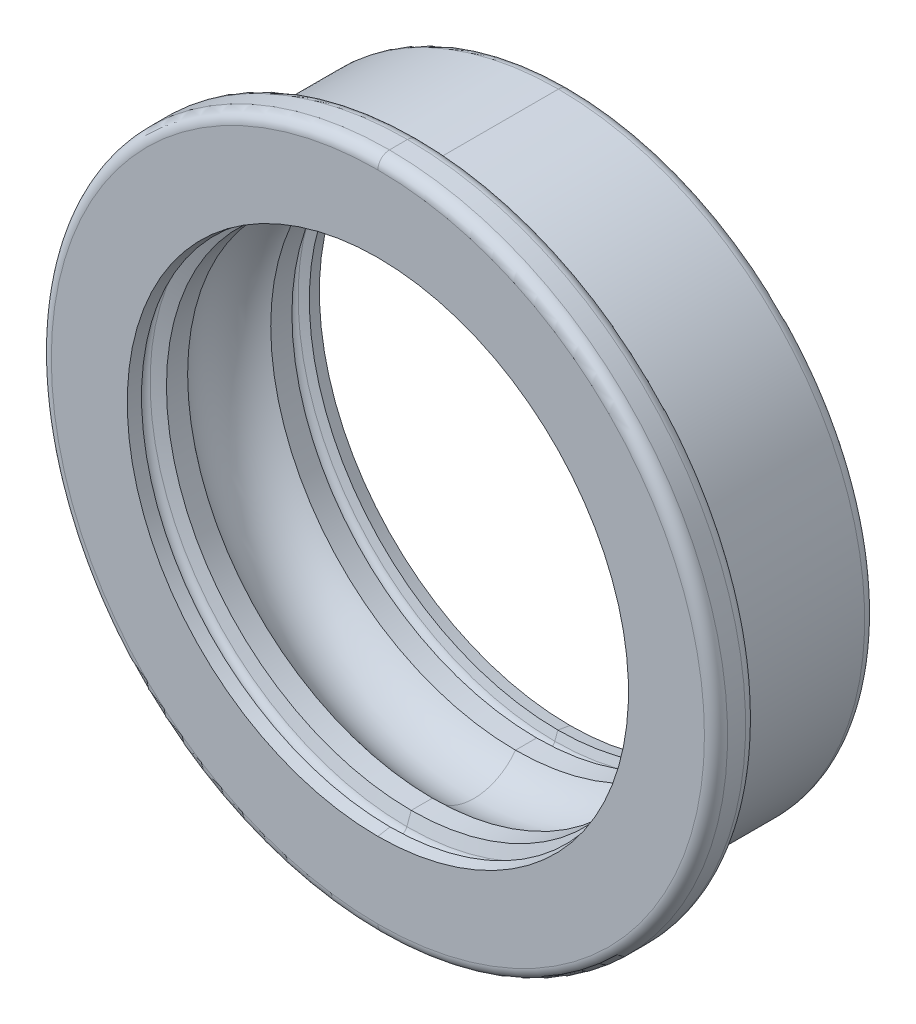
ISO-10303-21;
HEADER;
FILE_DESCRIPTION(('STEP AP214'),'2;1');
FILE_NAME('part.step','',(''),(''),'','','');
FILE_SCHEMA(('AUTOMOTIVE_DESIGN { 1 0 10303 214 1 1 1 1 }'));
ENDSEC;
DATA;
#1=APPLICATION_CONTEXT('core data for automotive mechanical design processes');
#2=APPLICATION_PROTOCOL_DEFINITION('international standard','automotive_design',2000,#1);
#3=PRODUCT_CONTEXT('',#1,'mechanical');
#4=PRODUCT('Part','Part','',(#3));
#5=PRODUCT_RELATED_PRODUCT_CATEGORY('part','',(#4));
#6=PRODUCT_DEFINITION_FORMATION('','',#4);
#7=PRODUCT_DEFINITION_CONTEXT('part definition',#1,'design');
#8=PRODUCT_DEFINITION('design','',#6,#7);
#9=PRODUCT_DEFINITION_SHAPE('','',#8);
#10=(LENGTH_UNIT() NAMED_UNIT(*) SI_UNIT(.MILLI.,.METRE.));
#11=(NAMED_UNIT(*) PLANE_ANGLE_UNIT() SI_UNIT($,.RADIAN.));
#12=(NAMED_UNIT(*) SI_UNIT($,.STERADIAN.) SOLID_ANGLE_UNIT());
#13=UNCERTAINTY_MEASURE_WITH_UNIT(LENGTH_MEASURE(1.E-05),#10,'distance_accuracy_value','');
#14=(GEOMETRIC_REPRESENTATION_CONTEXT(3) GLOBAL_UNCERTAINTY_ASSIGNED_CONTEXT((#13)) GLOBAL_UNIT_ASSIGNED_CONTEXT((#10,
#11,#12)) REPRESENTATION_CONTEXT('',''));
#15=CARTESIAN_POINT('',(0.,0.,0.));
#16=DIRECTION('',(0.,0.,1.));
#17=DIRECTION('',(1.,0.,0.));
#18=AXIS2_PLACEMENT_3D('',#15,#16,#17);
#19=CARTESIAN_POINT('',(0.,0.,2.18473570132836));
#20=DIRECTION('',(0.,0.,-1.));
#21=DIRECTION('',(0.,-1.,0.));
#22=AXIS2_PLACEMENT_3D('',#19,#20,#21);
#23=CONICAL_SURFACE('',#22,6.41101207873231,1.22173047639603);
#24=DIRECTION('',(0.,0.939692620785909,-0.342020143325669));
#25=VECTOR('',#24,1.);
#26=CARTESIAN_POINT('',(0.,6.43951920558143,2.17435995569083));
#27=LINE('',#26,#25);
#28=CARTESIAN_POINT('',(0.,6.4395192055807,2.17435995569106));
#29=VERTEX_POINT('',#28);
#30=CARTESIAN_POINT('',(0.,6.65285673739189,2.09671144426003));
#31=VERTEX_POINT('',#30);
#32=EDGE_CURVE('E421',#29,#31,#27,.T.);
#33=ORIENTED_EDGE('',*,*,#32,.T.);
#34=CARTESIAN_POINT('',(0.,0.,2.09671144426005));
#35=DIRECTION('',(0.,0.,-1.));
#36=DIRECTION('',(0.,1.,0.));
#37=AXIS2_PLACEMENT_3D('',#34,#35,#36);
#38=CIRCLE('',#37,6.6528567373919);
#39=CARTESIAN_POINT('',(0.,-6.65285673739189,2.09671144426003));
#40=VERTEX_POINT('',#39);
#41=EDGE_CURVE('E400',#31,#40,#38,.T.);
#42=ORIENTED_EDGE('',*,*,#41,.T.);
#43=DIRECTION('',(0.,-0.939692620785909,-0.342020143325669));
#44=VECTOR('',#43,1.);
#45=CARTESIAN_POINT('',(0.,-6.43951920558143,2.17435995569083));
#46=LINE('',#45,#44);
#47=CARTESIAN_POINT('',(0.,-6.4395192055807,2.17435995569106));
#48=VERTEX_POINT('',#47);
#49=EDGE_CURVE('E20',#48,#40,#46,.T.);
#50=ORIENTED_EDGE('',*,*,#49,.F.);
#51=CARTESIAN_POINT('',(0.,0.,2.17435995569127));
#52=DIRECTION('',(0.,0.,1.));
#53=DIRECTION('',(0.,-1.,0.));
#54=AXIS2_PLACEMENT_3D('',#51,#52,#53);
#55=CIRCLE('',#54,6.43951920557997);
#56=EDGE_CURVE('E11',#48,#29,#55,.T.);
#57=ORIENTED_EDGE('',*,*,#56,.T.);
#58=EDGE_LOOP('',(#33,#42,#50,#57));
#59=FACE_BOUND('',#58,.T.);
#60=ADVANCED_FACE('F17',(#59),#23,.F.);
#61=CARTESIAN_POINT('',(0.,0.,2.14448418683228));
#62=DIRECTION('',(0.,0.,1.));
#63=DIRECTION('',(0.,1.,0.));
#64=AXIS2_PLACEMENT_3D('',#61,#62,#63);
#65=CONICAL_SURFACE('',#64,6.43425130146072,0.174532925199433);
#66=DIRECTION('',(0.,-0.173648177666928,0.984807753012208));
#67=VECTOR('',#66,1.);
#68=CARTESIAN_POINT('',(0.,-6.43951920557997,2.17435995569128));
#69=LINE('',#68,#67);
#70=CARTESIAN_POINT('',(0.,-6.49503399999938,2.48920000000011));
#71=VERTEX_POINT('',#70);
#72=EDGE_CURVE('E425',#48,#71,#69,.T.);
#73=ORIENTED_EDGE('',*,*,#72,.T.);
#74=CARTESIAN_POINT('',(0.,0.,2.48920000000016));
#75=DIRECTION('',(0.,0.,1.));
#76=DIRECTION('',(0.,-1.,0.));
#77=AXIS2_PLACEMENT_3D('',#74,#75,#76);
#78=CIRCLE('',#77,6.49503399999907);
#79=CARTESIAN_POINT('',(0.,6.49503399999938,2.48920000000011));
#80=VERTEX_POINT('',#79);
#81=EDGE_CURVE('E197',#71,#80,#78,.T.);
#82=ORIENTED_EDGE('',*,*,#81,.T.);
#83=DIRECTION('',(0.,0.173648177666928,0.984807753012208));
#84=VECTOR('',#83,1.);
#85=CARTESIAN_POINT('',(0.,6.43951920557997,2.17435995569128));
#86=LINE('',#85,#84);
#87=EDGE_CURVE('E25',#29,#80,#86,.T.);
#88=ORIENTED_EDGE('',*,*,#87,.F.);
#89=ORIENTED_EDGE('',*,*,#56,.F.);
#90=EDGE_LOOP('',(#73,#82,#88,#89));
#91=FACE_BOUND('',#90,.T.);
#92=ADVANCED_FACE('F436',(#91),#65,.F.);
#93=CARTESIAN_POINT('',(0.,0.,2.14448418683228));
#94=DIRECTION('',(0.,0.,1.));
#95=DIRECTION('',(0.,1.,0.));
#96=AXIS2_PLACEMENT_3D('',#93,#94,#95);
#97=CONICAL_SURFACE('',#96,6.43425130146072,0.174532925199433);
#98=ORIENTED_EDGE('',*,*,#87,.T.);
#99=CARTESIAN_POINT('',(0.,0.,2.48920000000016));
#100=DIRECTION('',(0.,0.,1.));
#101=DIRECTION('',(0.,1.,0.));
#102=AXIS2_PLACEMENT_3D('',#99,#100,#101);
#103=CIRCLE('',#102,6.49503399999907);
#104=EDGE_CURVE('E208',#80,#71,#103,.T.);
#105=ORIENTED_EDGE('',*,*,#104,.T.);
#106=ORIENTED_EDGE('',*,*,#72,.F.);
#107=CARTESIAN_POINT('',(0.,0.,2.17435995569127));
#108=DIRECTION('',(0.,0.,1.));
#109=DIRECTION('',(0.,1.,0.));
#110=AXIS2_PLACEMENT_3D('',#107,#108,#109);
#111=CIRCLE('',#110,6.43951920557997);
#112=EDGE_CURVE('E420',#29,#48,#111,.T.);
#113=ORIENTED_EDGE('',*,*,#112,.F.);
#114=EDGE_LOOP('',(#98,#105,#106,#113));
#115=FACE_BOUND('',#114,.T.);
#116=ADVANCED_FACE('F430',(#115),#97,.F.);
#117=CARTESIAN_POINT('',(0.,0.,2.18473570132836));
#118=DIRECTION('',(0.,0.,-1.));
#119=DIRECTION('',(0.,-1.,0.));
#120=AXIS2_PLACEMENT_3D('',#117,#118,#119);
#121=CONICAL_SURFACE('',#120,6.41101207873231,1.22173047639603);
#122=ORIENTED_EDGE('',*,*,#49,.T.);
#123=CARTESIAN_POINT('',(0.,0.,2.09671144426005));
#124=DIRECTION('',(0.,0.,-1.));
#125=DIRECTION('',(0.,-1.,0.));
#126=AXIS2_PLACEMENT_3D('',#123,#124,#125);
#127=CIRCLE('',#126,6.6528567373919);
#128=EDGE_CURVE('E407',#40,#31,#127,.T.);
#129=ORIENTED_EDGE('',*,*,#128,.T.);
#130=ORIENTED_EDGE('',*,*,#32,.F.);
#131=ORIENTED_EDGE('',*,*,#112,.T.);
#132=EDGE_LOOP('',(#122,#129,#130,#131));
#133=FACE_BOUND('',#132,.T.);
#134=ADVANCED_FACE('F438',(#133),#121,.F.);
#135=CARTESIAN_POINT('',(0.,0.,1.9177));
#136=DIRECTION('',(0.,0.,-1.));
#137=DIRECTION('',(0.,-1.,0.));
#138=AXIS2_PLACEMENT_3D('',#135,#136,#137);
#139=TOROIDAL_SURFACE('',#138,6.58770190008928,0.1905);
#140=ORIENTED_EDGE('',*,*,#128,.F.);
#141=CARTESIAN_POINT('',(0.,-6.58770190008928,1.9177));
#142=DIRECTION('',(1.,0.,0.));
#143=DIRECTION('',(0.,-0.342020143320849,0.939692620787662));
#144=AXIS2_PLACEMENT_3D('',#141,#142,#143);
#145=CIRCLE('',#144,0.1905);
#146=CARTESIAN_POINT('',(0.,-6.77820190008928,1.9177));
#147=VERTEX_POINT('',#146);
#148=EDGE_CURVE('E402',#40,#147,#145,.T.);
#149=ORIENTED_EDGE('',*,*,#148,.T.);
#150=CARTESIAN_POINT('',(0.,-6.58770190008928,1.9177));
#151=DIRECTION('',(1.,0.,0.));
#152=DIRECTION('',(0.,-1.,0.));
#153=AXIS2_PLACEMENT_3D('',#150,#151,#152);
#154=CIRCLE('',#153,0.1905);
#155=CARTESIAN_POINT('',(0.,-6.65285673739188,1.73868855574004));
#156=VERTEX_POINT('',#155);
#157=EDGE_CURVE('E405',#147,#156,#154,.T.);
#158=ORIENTED_EDGE('',*,*,#157,.T.);
#159=CARTESIAN_POINT('',(0.,0.,1.73868855573995));
#160=DIRECTION('',(0.,0.,1.));
#161=DIRECTION('',(0.,1.,0.));
#162=AXIS2_PLACEMENT_3D('',#159,#160,#161);
#163=CIRCLE('',#162,6.6528567373919);
#164=CARTESIAN_POINT('',(0.,6.65285673739188,1.73868855574004));
#165=VERTEX_POINT('',#164);
#166=EDGE_CURVE('E397',#165,#156,#163,.T.);
#167=ORIENTED_EDGE('',*,*,#166,.F.);
#168=CARTESIAN_POINT('',(0.,6.58770190008928,1.9177));
#169=DIRECTION('',(-1.,0.,0.));
#170=DIRECTION('',(0.,1.,0.));
#171=AXIS2_PLACEMENT_3D('',#168,#169,#170);
#172=CIRCLE('',#171,0.1905);
#173=CARTESIAN_POINT('',(0.,6.77820190008928,1.9177));
#174=VERTEX_POINT('',#173);
#175=EDGE_CURVE('E411',#174,#165,#172,.T.);
#176=ORIENTED_EDGE('',*,*,#175,.F.);
#177=CARTESIAN_POINT('',(0.,6.58770190008928,1.9177));
#178=DIRECTION('',(-1.,0.,0.));
#179=DIRECTION('',(0.,0.342020143320849,0.939692620787662));
#180=AXIS2_PLACEMENT_3D('',#177,#178,#179);
#181=CIRCLE('',#180,0.1905);
#182=EDGE_CURVE('E403',#31,#174,#181,.T.);
#183=ORIENTED_EDGE('',*,*,#182,.F.);
#184=EDGE_LOOP('',(#140,#149,#158,#167,#176,#183));
#185=FACE_BOUND('',#184,.T.);
#186=ADVANCED_FACE('F448',(#185),#139,.F.);
#187=CARTESIAN_POINT('',(0.,0.,1.9177));
#188=DIRECTION('',(0.,0.,-1.));
#189=DIRECTION('',(0.,-1.,0.));
#190=AXIS2_PLACEMENT_3D('',#187,#188,#189);
#191=TOROIDAL_SURFACE('',#190,6.58770190008928,0.1905);
#192=CARTESIAN_POINT('',(0.,0.,1.73868855573995));
#193=DIRECTION('',(0.,0.,1.));
#194=DIRECTION('',(0.,-1.,0.));
#195=AXIS2_PLACEMENT_3D('',#192,#193,#194);
#196=CIRCLE('',#195,6.6528567373919);
#197=EDGE_CURVE('E408',#156,#165,#196,.T.);
#198=ORIENTED_EDGE('',*,*,#197,.F.);
#199=ORIENTED_EDGE('',*,*,#157,.F.);
#200=ORIENTED_EDGE('',*,*,#148,.F.);
#201=ORIENTED_EDGE('',*,*,#41,.F.);
#202=ORIENTED_EDGE('',*,*,#182,.T.);
#203=ORIENTED_EDGE('',*,*,#175,.T.);
#204=EDGE_LOOP('',(#198,#199,#200,#201,#202,#203));
#205=FACE_BOUND('',#204,.T.);
#206=ADVANCED_FACE('F445',(#205),#191,.F.);
#207=CARTESIAN_POINT('',(0.,0.,1.61546132153431));
#208=DIRECTION('',(0.,0.,1.));
#209=DIRECTION('',(0.,1.,0.));
#210=AXIS2_PLACEMENT_3D('',#207,#208,#209);
#211=CONICAL_SURFACE('',#210,6.31429269394952,1.22173047639603);
#212=CARTESIAN_POINT('',(0.,0.,1.62583706717184));
#213=DIRECTION('',(0.,0.,1.));
#214=DIRECTION('',(0.,-1.,0.));
#215=AXIS2_PLACEMENT_3D('',#212,#213,#214);
#216=CIRCLE('',#215,6.34279982079864);
#217=CARTESIAN_POINT('',(0.,-6.34279982079865,1.62583706717181));
#218=VERTEX_POINT('',#217);
#219=CARTESIAN_POINT('',(0.,6.34279982079865,1.62583706717181));
#220=VERTEX_POINT('',#219);
#221=EDGE_CURVE('E386',#218,#220,#216,.T.);
#222=ORIENTED_EDGE('',*,*,#221,.F.);
#223=DIRECTION('',(0.,0.939692620785908,-0.342020143325669));
#224=VECTOR('',#223,1.);
#225=CARTESIAN_POINT('',(0.,-6.65285673739185,1.73868855574012));
#226=LINE('',#225,#224);
#227=EDGE_CURVE('E392',#156,#218,#226,.T.);
#228=ORIENTED_EDGE('',*,*,#227,.F.);
#229=ORIENTED_EDGE('',*,*,#197,.T.);
#230=DIRECTION('',(0.,-0.939692620785908,-0.342020143325669));
#231=VECTOR('',#230,1.);
#232=CARTESIAN_POINT('',(0.,6.65285673739185,1.73868855574012));
#233=LINE('',#232,#231);
#234=EDGE_CURVE('E390',#165,#220,#233,.T.);
#235=ORIENTED_EDGE('',*,*,#234,.T.);
#236=EDGE_LOOP('',(#222,#228,#229,#235));
#237=FACE_BOUND('',#236,.T.);
#238=ADVANCED_FACE('F452',(#237),#211,.F.);
#239=CARTESIAN_POINT('',(0.,0.,1.61546132153431));
#240=DIRECTION('',(0.,0.,1.));
#241=DIRECTION('',(0.,1.,0.));
#242=AXIS2_PLACEMENT_3D('',#239,#240,#241);
#243=CONICAL_SURFACE('',#242,6.31429269394952,1.22173047639603);
#244=ORIENTED_EDGE('',*,*,#166,.T.);
#245=ORIENTED_EDGE('',*,*,#227,.T.);
#246=CARTESIAN_POINT('',(0.,0.,1.62583706717184));
#247=DIRECTION('',(0.,0.,1.));
#248=DIRECTION('',(0.,1.,0.));
#249=AXIS2_PLACEMENT_3D('',#246,#247,#248);
#250=CIRCLE('',#249,6.34279982079864);
#251=EDGE_CURVE('E389',#220,#218,#250,.T.);
#252=ORIENTED_EDGE('',*,*,#251,.F.);
#253=ORIENTED_EDGE('',*,*,#234,.F.);
#254=EDGE_LOOP('',(#244,#245,#252,#253));
#255=FACE_BOUND('',#254,.T.);
#256=ADVANCED_FACE('F455',(#255),#243,.F.);
#257=CARTESIAN_POINT('',(0.,0.,0.12446));
#258=DIRECTION('',(0.,0.,-1.));
#259=DIRECTION('',(0.,-1.,0.));
#260=AXIS2_PLACEMENT_3D('',#257,#258,#259);
#261=CYLINDRICAL_SURFACE('',#260,6.34279982079866);
#262=DIRECTION('',(0.,0.,1.));
#263=VECTOR('',#262,1.);
#264=CARTESIAN_POINT('',(0.,6.34279982079866,1.07682943375516));
#265=LINE('',#264,#263);
#266=CARTESIAN_POINT('',(0.,6.34279982079867,1.07682943375518));
#267=VERTEX_POINT('',#266);
#268=EDGE_CURVE('E373',#267,#220,#265,.T.);
#269=ORIENTED_EDGE('',*,*,#268,.T.);
#270=ORIENTED_EDGE('',*,*,#251,.T.);
#271=DIRECTION('',(0.,0.,-1.));
#272=VECTOR('',#271,1.);
#273=CARTESIAN_POINT('',(0.,-6.34279982079866,1.62583706717179));
#274=LINE('',#273,#272);
#275=CARTESIAN_POINT('',(0.,-6.34279982079867,1.07682943375518));
#276=VERTEX_POINT('',#275);
#277=EDGE_CURVE('E387',#218,#276,#274,.T.);
#278=ORIENTED_EDGE('',*,*,#277,.T.);
#279=CARTESIAN_POINT('',(0.,0.,1.0768294337552));
#280=DIRECTION('',(0.,0.,-1.));
#281=DIRECTION('',(0.,-1.,0.));
#282=AXIS2_PLACEMENT_3D('',#279,#280,#281);
#283=CIRCLE('',#282,6.34279982079869);
#284=EDGE_CURVE('E360',#276,#267,#283,.T.);
#285=ORIENTED_EDGE('',*,*,#284,.T.);
#286=EDGE_LOOP('',(#269,#270,#278,#285));
#287=FACE_BOUND('',#286,.T.);
#288=ADVANCED_FACE('F459',(#287),#261,.F.);
#289=CARTESIAN_POINT('',(0.,0.,0.12446));
#290=DIRECTION('',(0.,0.,-1.));
#291=DIRECTION('',(0.,-1.,0.));
#292=AXIS2_PLACEMENT_3D('',#289,#290,#291);
#293=CYLINDRICAL_SURFACE('',#292,6.34279982079866);
#294=ORIENTED_EDGE('',*,*,#277,.F.);
#295=ORIENTED_EDGE('',*,*,#221,.T.);
#296=ORIENTED_EDGE('',*,*,#268,.F.);
#297=CARTESIAN_POINT('',(0.,0.,1.0768294337552));
#298=DIRECTION('',(0.,0.,-1.));
#299=DIRECTION('',(0.,1.,0.));
#300=AXIS2_PLACEMENT_3D('',#297,#298,#299);
#301=CIRCLE('',#300,6.34279982079869);
#302=EDGE_CURVE('E370',#267,#276,#301,.T.);
#303=ORIENTED_EDGE('',*,*,#302,.T.);
#304=EDGE_LOOP('',(#294,#295,#296,#303));
#305=FACE_BOUND('',#304,.T.);
#306=ADVANCED_FACE('F463',(#305),#293,.F.);
#307=CARTESIAN_POINT('',(0.,0.,0.12446));
#308=DIRECTION('',(0.,0.,-1.));
#309=DIRECTION('',(0.,-1.,0.));
#310=AXIS2_PLACEMENT_3D('',#307,#308,#309);
#311=CYLINDRICAL_SURFACE('',#310,6.34279982079866);
#312=DIRECTION('',(0.,0.,1.));
#313=VECTOR('',#312,1.);
#314=CARTESIAN_POINT('',(0.,6.34279982079866,-1.62583706717179));
#315=LINE('',#314,#313);
#316=CARTESIAN_POINT('',(0.,6.34279982079865,-1.62583706717181));
#317=VERTEX_POINT('',#316);
#318=CARTESIAN_POINT('',(0.,6.34279982079867,-1.07682943375518));
#319=VERTEX_POINT('',#318);
#320=EDGE_CURVE('E359',#317,#319,#315,.T.);
#321=ORIENTED_EDGE('',*,*,#320,.F.);
#322=CARTESIAN_POINT('',(0.,0.,-1.62583706717184));
#323=DIRECTION('',(0.,0.,-1.));
#324=DIRECTION('',(0.,1.,0.));
#325=AXIS2_PLACEMENT_3D('',#322,#323,#324);
#326=CIRCLE('',#325,6.34279982079864);
#327=CARTESIAN_POINT('',(0.,-6.34279982079865,-1.62583706717181));
#328=VERTEX_POINT('',#327);
#329=EDGE_CURVE('E348',#317,#328,#326,.T.);
#330=ORIENTED_EDGE('',*,*,#329,.T.);
#331=DIRECTION('',(0.,0.,-1.));
#332=VECTOR('',#331,1.);
#333=CARTESIAN_POINT('',(0.,-6.34279982079866,-1.07682943375516));
#334=LINE('',#333,#332);
#335=CARTESIAN_POINT('',(0.,-6.34279982079867,-1.07682943375518));
#336=VERTEX_POINT('',#335);
#337=EDGE_CURVE('E379',#336,#328,#334,.T.);
#338=ORIENTED_EDGE('',*,*,#337,.F.);
#339=CARTESIAN_POINT('',(0.,0.,-1.0768294337552));
#340=DIRECTION('',(0.,0.,1.));
#341=DIRECTION('',(0.,-1.,0.));
#342=AXIS2_PLACEMENT_3D('',#339,#340,#341);
#343=CIRCLE('',#342,6.34279982079869);
#344=EDGE_CURVE('E368',#336,#319,#343,.T.);
#345=ORIENTED_EDGE('',*,*,#344,.T.);
#346=EDGE_LOOP('',(#321,#330,#338,#345));
#347=FACE_BOUND('',#346,.T.);
#348=ADVANCED_FACE('F477',(#347),#311,.F.);
#349=CARTESIAN_POINT('',(0.,0.,0.));
#350=DIRECTION('',(0.,0.,-1.));
#351=DIRECTION('',(0.,-1.,0.));
#352=AXIS2_PLACEMENT_3D('',#349,#350,#351);
#353=TOROIDAL_SURFACE('',#352,5.55625,1.3335);
#354=CARTESIAN_POINT('',(0.,-5.55625,0.));
#355=DIRECTION('',(1.,0.,0.));
#356=DIRECTION('',(0.,-1.,0.));
#357=AXIS2_PLACEMENT_3D('',#354,#355,#356);
#358=CIRCLE('',#357,1.3335);
#359=CARTESIAN_POINT('',(0.,-6.88975,0.));
#360=VERTEX_POINT('',#359);
#361=EDGE_CURVE('E376',#360,#336,#358,.T.);
#362=ORIENTED_EDGE('',*,*,#361,.F.);
#363=CARTESIAN_POINT('',(0.,-5.55625,0.));
#364=DIRECTION('',(1.,0.,0.));
#365=DIRECTION('',(0.,-0.589838635769545,0.807521135174505));
#366=AXIS2_PLACEMENT_3D('',#363,#364,#365);
#367=CIRCLE('',#366,1.3335);
#368=EDGE_CURVE('E363',#276,#360,#367,.T.);
#369=ORIENTED_EDGE('',*,*,#368,.F.);
#370=ORIENTED_EDGE('',*,*,#302,.F.);
#371=CARTESIAN_POINT('',(0.,5.55625,0.));
#372=DIRECTION('',(-1.,0.,0.));
#373=DIRECTION('',(0.,0.589838635769545,0.807521135174505));
#374=AXIS2_PLACEMENT_3D('',#371,#372,#373);
#375=CIRCLE('',#374,1.3335);
#376=CARTESIAN_POINT('',(0.,6.88975,0.));
#377=VERTEX_POINT('',#376);
#378=EDGE_CURVE('E362',#267,#377,#375,.T.);
#379=ORIENTED_EDGE('',*,*,#378,.T.);
#380=CARTESIAN_POINT('',(0.,5.55625,0.));
#381=DIRECTION('',(-1.,0.,0.));
#382=DIRECTION('',(0.,1.,0.));
#383=AXIS2_PLACEMENT_3D('',#380,#381,#382);
#384=CIRCLE('',#383,1.3335);
#385=EDGE_CURVE('E365',#377,#319,#384,.T.);
#386=ORIENTED_EDGE('',*,*,#385,.T.);
#387=ORIENTED_EDGE('',*,*,#344,.F.);
#388=EDGE_LOOP('',(#362,#369,#370,#379,#386,#387));
#389=FACE_BOUND('',#388,.T.);
#390=ADVANCED_FACE('F467',(#389),#353,.F.);
#391=CARTESIAN_POINT('',(0.,0.,0.));
#392=DIRECTION('',(0.,0.,-1.));
#393=DIRECTION('',(0.,-1.,0.));
#394=AXIS2_PLACEMENT_3D('',#391,#392,#393);
#395=TOROIDAL_SURFACE('',#394,5.55625,1.3335);
#396=ORIENTED_EDGE('',*,*,#385,.F.);
#397=ORIENTED_EDGE('',*,*,#378,.F.);
#398=ORIENTED_EDGE('',*,*,#284,.F.);
#399=ORIENTED_EDGE('',*,*,#368,.T.);
#400=ORIENTED_EDGE('',*,*,#361,.T.);
#401=CARTESIAN_POINT('',(0.,0.,-1.0768294337552));
#402=DIRECTION('',(0.,0.,1.));
#403=DIRECTION('',(0.,1.,0.));
#404=AXIS2_PLACEMENT_3D('',#401,#402,#403);
#405=CIRCLE('',#404,6.34279982079869);
#406=EDGE_CURVE('E356',#319,#336,#405,.T.);
#407=ORIENTED_EDGE('',*,*,#406,.F.);
#408=EDGE_LOOP('',(#396,#397,#398,#399,#400,#407));
#409=FACE_BOUND('',#408,.T.);
#410=ADVANCED_FACE('F471',(#409),#395,.F.);
#411=CARTESIAN_POINT('',(0.,0.,0.12446));
#412=DIRECTION('',(0.,0.,-1.));
#413=DIRECTION('',(0.,-1.,0.));
#414=AXIS2_PLACEMENT_3D('',#411,#412,#413);
#415=CYLINDRICAL_SURFACE('',#414,6.34279982079866);
#416=ORIENTED_EDGE('',*,*,#337,.T.);
#417=CARTESIAN_POINT('',(0.,0.,-1.62583706717184));
#418=DIRECTION('',(0.,0.,-1.));
#419=DIRECTION('',(0.,-1.,0.));
#420=AXIS2_PLACEMENT_3D('',#417,#418,#419);
#421=CIRCLE('',#420,6.34279982079864);
#422=EDGE_CURVE('E353',#328,#317,#421,.T.);
#423=ORIENTED_EDGE('',*,*,#422,.T.);
#424=ORIENTED_EDGE('',*,*,#320,.T.);
#425=ORIENTED_EDGE('',*,*,#406,.T.);
#426=EDGE_LOOP('',(#416,#423,#424,#425));
#427=FACE_BOUND('',#426,.T.);
#428=ADVANCED_FACE('F474',(#427),#415,.F.);
#429=CARTESIAN_POINT('',(0.,0.,-1.61546132153431));
#430=DIRECTION('',(0.,0.,-1.));
#431=DIRECTION('',(0.,-1.,0.));
#432=AXIS2_PLACEMENT_3D('',#429,#430,#431);
#433=CONICAL_SURFACE('',#432,6.31429269394952,1.22173047639603);
#434=ORIENTED_EDGE('',*,*,#422,.F.);
#435=DIRECTION('',(0.,0.939692620785908,0.342020143325669));
#436=VECTOR('',#435,1.);
#437=CARTESIAN_POINT('',(0.,-6.65285673739185,-1.73868855574012));
#438=LINE('',#437,#436);
#439=CARTESIAN_POINT('',(0.,-6.65285673739187,-1.73868855574004));
#440=VERTEX_POINT('',#439);
#441=EDGE_CURVE('E350',#440,#328,#438,.T.);
#442=ORIENTED_EDGE('',*,*,#441,.F.);
#443=CARTESIAN_POINT('',(0.,0.,-1.73868855573995));
#444=DIRECTION('',(0.,0.,-1.));
#445=DIRECTION('',(0.,-1.,0.));
#446=AXIS2_PLACEMENT_3D('',#443,#444,#445);
#447=CIRCLE('',#446,6.6528567373919);
#448=CARTESIAN_POINT('',(0.,6.65285673739187,-1.73868855574004));
#449=VERTEX_POINT('',#448);
#450=EDGE_CURVE('E334',#440,#449,#447,.T.);
#451=ORIENTED_EDGE('',*,*,#450,.T.);
#452=DIRECTION('',(0.,-0.939692620785908,0.342020143325669));
#453=VECTOR('',#452,1.);
#454=CARTESIAN_POINT('',(0.,6.65285673739185,-1.73868855574012));
#455=LINE('',#454,#453);
#456=EDGE_CURVE('E343',#449,#317,#455,.T.);
#457=ORIENTED_EDGE('',*,*,#456,.T.);
#458=EDGE_LOOP('',(#434,#442,#451,#457));
#459=FACE_BOUND('',#458,.T.);
#460=ADVANCED_FACE('F480',(#459),#433,.F.);
#461=CARTESIAN_POINT('',(0.,0.,-1.61546132153431));
#462=DIRECTION('',(0.,0.,-1.));
#463=DIRECTION('',(0.,-1.,0.));
#464=AXIS2_PLACEMENT_3D('',#461,#462,#463);
#465=CONICAL_SURFACE('',#464,6.31429269394952,1.22173047639603);
#466=CARTESIAN_POINT('',(0.,0.,-1.73868855573995));
#467=DIRECTION('',(0.,0.,-1.));
#468=DIRECTION('',(0.,1.,0.));
#469=AXIS2_PLACEMENT_3D('',#466,#467,#468);
#470=CIRCLE('',#469,6.6528567373919);
#471=EDGE_CURVE('E336',#449,#440,#470,.T.);
#472=ORIENTED_EDGE('',*,*,#471,.T.);
#473=ORIENTED_EDGE('',*,*,#441,.T.);
#474=ORIENTED_EDGE('',*,*,#329,.F.);
#475=ORIENTED_EDGE('',*,*,#456,.F.);
#476=EDGE_LOOP('',(#472,#473,#474,#475));
#477=FACE_BOUND('',#476,.T.);
#478=ADVANCED_FACE('F483',(#477),#465,.F.);
#479=CARTESIAN_POINT('',(0.,0.,-1.9177));
#480=DIRECTION('',(0.,0.,-1.));
#481=DIRECTION('',(0.,-1.,0.));
#482=AXIS2_PLACEMENT_3D('',#479,#480,#481);
#483=TOROIDAL_SURFACE('',#482,6.58770190008928,0.1905);
#484=CARTESIAN_POINT('',(0.,0.,-2.09671144426005));
#485=DIRECTION('',(0.,0.,1.));
#486=DIRECTION('',(0.,-1.,0.));
#487=AXIS2_PLACEMENT_3D('',#484,#485,#486);
#488=CIRCLE('',#487,6.6528567373919);
#489=CARTESIAN_POINT('',(0.,-6.65285673739189,-2.09671144426003));
#490=VERTEX_POINT('',#489);
#491=CARTESIAN_POINT('',(0.,6.65285673739189,-2.09671144426003));
#492=VERTEX_POINT('',#491);
#493=EDGE_CURVE('E320',#490,#492,#488,.T.);
#494=ORIENTED_EDGE('',*,*,#493,.F.);
#495=CARTESIAN_POINT('',(0.,-6.58770190008928,-1.9177));
#496=DIRECTION('',(-1.,0.,0.));
#497=DIRECTION('',(0.,-0.342020143320849,-0.939692620787662));
#498=AXIS2_PLACEMENT_3D('',#495,#496,#497);
#499=CIRCLE('',#498,0.1905);
#500=CARTESIAN_POINT('',(0.,-6.77820190008928,-1.9177));
#501=VERTEX_POINT('',#500);
#502=EDGE_CURVE('E328',#490,#501,#499,.T.);
#503=ORIENTED_EDGE('',*,*,#502,.T.);
#504=CARTESIAN_POINT('',(0.,-6.58770190008928,-1.9177));
#505=DIRECTION('',(-1.,0.,0.));
#506=DIRECTION('',(0.,-1.,0.));
#507=AXIS2_PLACEMENT_3D('',#504,#505,#506);
#508=CIRCLE('',#507,0.1905);
#509=EDGE_CURVE('E330',#501,#440,#508,.T.);
#510=ORIENTED_EDGE('',*,*,#509,.T.);
#511=ORIENTED_EDGE('',*,*,#471,.F.);
#512=CARTESIAN_POINT('',(0.,6.58770190008928,-1.9177));
#513=DIRECTION('',(1.,0.,0.));
#514=DIRECTION('',(0.,1.,0.));
#515=AXIS2_PLACEMENT_3D('',#512,#513,#514);
#516=CIRCLE('',#515,0.1905);
#517=CARTESIAN_POINT('',(0.,6.77820190008928,-1.9177));
#518=VERTEX_POINT('',#517);
#519=EDGE_CURVE('E327',#518,#449,#516,.T.);
#520=ORIENTED_EDGE('',*,*,#519,.F.);
#521=CARTESIAN_POINT('',(0.,6.58770190008928,-1.9177));
#522=DIRECTION('',(1.,0.,0.));
#523=DIRECTION('',(0.,0.342020143320849,-0.939692620787662));
#524=AXIS2_PLACEMENT_3D('',#521,#522,#523);
#525=CIRCLE('',#524,0.1905);
#526=EDGE_CURVE('E331',#492,#518,#525,.T.);
#527=ORIENTED_EDGE('',*,*,#526,.F.);
#528=EDGE_LOOP('',(#494,#503,#510,#511,#520,#527));
#529=FACE_BOUND('',#528,.T.);
#530=ADVANCED_FACE('F488',(#529),#483,.F.);
#531=CARTESIAN_POINT('',(0.,0.,-1.9177));
#532=DIRECTION('',(0.,0.,-1.));
#533=DIRECTION('',(0.,-1.,0.));
#534=AXIS2_PLACEMENT_3D('',#531,#532,#533);
#535=TOROIDAL_SURFACE('',#534,6.58770190008928,0.1905);
#536=ORIENTED_EDGE('',*,*,#450,.F.);
#537=ORIENTED_EDGE('',*,*,#509,.F.);
#538=ORIENTED_EDGE('',*,*,#502,.F.);
#539=CARTESIAN_POINT('',(0.,0.,-2.09671144426005));
#540=DIRECTION('',(0.,0.,1.));
#541=DIRECTION('',(0.,1.,0.));
#542=AXIS2_PLACEMENT_3D('',#539,#540,#541);
#543=CIRCLE('',#542,6.6528567373919);
#544=EDGE_CURVE('E319',#492,#490,#543,.T.);
#545=ORIENTED_EDGE('',*,*,#544,.F.);
#546=ORIENTED_EDGE('',*,*,#526,.T.);
#547=ORIENTED_EDGE('',*,*,#519,.T.);
#548=EDGE_LOOP('',(#536,#537,#538,#545,#546,#547));
#549=FACE_BOUND('',#548,.T.);
#550=ADVANCED_FACE('F491',(#549),#535,.F.);
#551=CARTESIAN_POINT('',(0.,0.,-2.18473570132836));
#552=DIRECTION('',(0.,0.,1.));
#553=DIRECTION('',(0.,1.,0.));
#554=AXIS2_PLACEMENT_3D('',#551,#552,#553);
#555=CONICAL_SURFACE('',#554,6.41101207873232,1.22173047639603);
#556=DIRECTION('',(0.,-0.939692620785909,-0.342020143325669));
#557=VECTOR('',#556,1.);
#558=CARTESIAN_POINT('',(0.,6.65285673739189,-2.09671144426));
#559=LINE('',#558,#557);
#560=CARTESIAN_POINT('',(0.,6.4395192055807,-2.17435995569106));
#561=VERTEX_POINT('',#560);
#562=EDGE_CURVE('E316',#492,#561,#559,.T.);
#563=ORIENTED_EDGE('',*,*,#562,.F.);
#564=ORIENTED_EDGE('',*,*,#544,.T.);
#565=DIRECTION('',(0.,0.939692620785909,-0.342020143325669));
#566=VECTOR('',#565,1.);
#567=CARTESIAN_POINT('',(0.,-6.65285673739189,-2.09671144426));
#568=LINE('',#567,#566);
#569=CARTESIAN_POINT('',(0.,-6.4395192055807,-2.17435995569106));
#570=VERTEX_POINT('',#569);
#571=EDGE_CURVE('E317',#490,#570,#568,.T.);
#572=ORIENTED_EDGE('',*,*,#571,.T.);
#573=CARTESIAN_POINT('',(0.,0.,-2.17435995569083));
#574=DIRECTION('',(0.,0.,1.));
#575=DIRECTION('',(0.,1.,0.));
#576=AXIS2_PLACEMENT_3D('',#573,#574,#575);
#577=CIRCLE('',#576,6.43951920558143);
#578=EDGE_CURVE('E310',#561,#570,#577,.T.);
#579=ORIENTED_EDGE('',*,*,#578,.F.);
#580=EDGE_LOOP('',(#563,#564,#572,#579));
#581=FACE_BOUND('',#580,.T.);
#582=ADVANCED_FACE('F496',(#581),#555,.F.);
#583=CARTESIAN_POINT('',(0.,0.,-2.18473570132836));
#584=DIRECTION('',(0.,0.,1.));
#585=DIRECTION('',(0.,1.,0.));
#586=AXIS2_PLACEMENT_3D('',#583,#584,#585);
#587=CONICAL_SURFACE('',#586,6.41101207873232,1.22173047639603);
#588=ORIENTED_EDGE('',*,*,#571,.F.);
#589=ORIENTED_EDGE('',*,*,#493,.T.);
#590=ORIENTED_EDGE('',*,*,#562,.T.);
#591=CARTESIAN_POINT('',(0.,0.,-2.17435995569083));
#592=DIRECTION('',(0.,0.,1.));
#593=DIRECTION('',(0.,-1.,0.));
#594=AXIS2_PLACEMENT_3D('',#591,#592,#593);
#595=CIRCLE('',#594,6.43951920558143);
#596=EDGE_CURVE('E313',#570,#561,#595,.T.);
#597=ORIENTED_EDGE('',*,*,#596,.F.);
#598=EDGE_LOOP('',(#588,#589,#590,#597));
#599=FACE_BOUND('',#598,.T.);
#600=ADVANCED_FACE('F499',(#599),#587,.F.);
#601=CARTESIAN_POINT('',(0.,0.,-2.14448418683228));
#602=DIRECTION('',(0.,0.,-1.));
#603=DIRECTION('',(0.,-1.,0.));
#604=AXIS2_PLACEMENT_3D('',#601,#602,#603);
#605=CONICAL_SURFACE('',#604,6.43425130146072,0.174532925199433);
#606=CARTESIAN_POINT('',(0.,0.,-2.48920000000016));
#607=DIRECTION('',(0.,0.,-1.));
#608=DIRECTION('',(0.,1.,0.));
#609=AXIS2_PLACEMENT_3D('',#606,#607,#608);
#610=CIRCLE('',#609,6.49503399999907);
#611=CARTESIAN_POINT('',(0.,6.49503399999938,-2.48920000000011));
#612=VERTEX_POINT('',#611);
#613=CARTESIAN_POINT('',(0.,-6.49503399999938,-2.48920000000011));
#614=VERTEX_POINT('',#613);
#615=EDGE_CURVE('E304',#612,#614,#610,.T.);
#616=ORIENTED_EDGE('',*,*,#615,.T.);
#617=DIRECTION('',(0.,0.173648177666928,0.984807753012208));
#618=VECTOR('',#617,1.);
#619=CARTESIAN_POINT('',(0.,-6.49503399999907,-2.48920000000017));
#620=LINE('',#619,#618);
#621=EDGE_CURVE('E307',#614,#570,#620,.T.);
#622=ORIENTED_EDGE('',*,*,#621,.T.);
#623=ORIENTED_EDGE('',*,*,#596,.T.);
#624=DIRECTION('',(0.,-0.173648177666928,0.984807753012208));
#625=VECTOR('',#624,1.);
#626=CARTESIAN_POINT('',(0.,6.49503399999907,-2.48920000000017));
#627=LINE('',#626,#625);
#628=EDGE_CURVE('E306',#612,#561,#627,.T.);
#629=ORIENTED_EDGE('',*,*,#628,.F.);
#630=EDGE_LOOP('',(#616,#622,#623,#629));
#631=FACE_BOUND('',#630,.T.);
#632=ADVANCED_FACE('F502',(#631),#605,.F.);
#633=CARTESIAN_POINT('',(0.,0.,-2.14448418683228));
#634=DIRECTION('',(0.,0.,-1.));
#635=DIRECTION('',(0.,-1.,0.));
#636=AXIS2_PLACEMENT_3D('',#633,#634,#635);
#637=CONICAL_SURFACE('',#636,6.43425130146072,0.174532925199433);
#638=ORIENTED_EDGE('',*,*,#578,.T.);
#639=ORIENTED_EDGE('',*,*,#621,.F.);
#640=CARTESIAN_POINT('',(0.,0.,-2.48920000000016));
#641=DIRECTION('',(0.,0.,-1.));
#642=DIRECTION('',(0.,-1.,0.));
#643=AXIS2_PLACEMENT_3D('',#640,#641,#642);
#644=CIRCLE('',#643,6.49503399999907);
#645=EDGE_CURVE('E299',#614,#612,#644,.T.);
#646=ORIENTED_EDGE('',*,*,#645,.T.);
#647=ORIENTED_EDGE('',*,*,#628,.T.);
#648=EDGE_LOOP('',(#638,#639,#646,#647));
#649=FACE_BOUND('',#648,.T.);
#650=ADVANCED_FACE('F506',(#649),#637,.F.);
#651=CARTESIAN_POINT('',(0.,0.,-2.4892));
#652=DIRECTION('',(0.,0.,-1.));
#653=DIRECTION('',(0.,-1.,0.));
#654=AXIS2_PLACEMENT_3D('',#651,#652,#653);
#655=PLANE('',#654);
#656=ORIENTED_EDGE('',*,*,#615,.F.);
#657=ORIENTED_EDGE('',*,*,#645,.F.);
#658=EDGE_LOOP('',(#656,#657));
#659=FACE_BOUND('',#658,.T.);
#660=CARTESIAN_POINT('',(0.,0.,-2.4892));
#661=DIRECTION('',(0.,0.,1.));
#662=DIRECTION('',(0.,1.,0.));
#663=AXIS2_PLACEMENT_3D('',#660,#661,#662);
#664=CIRCLE('',#663,7.63778);
#665=CARTESIAN_POINT('',(0.,7.63778,-2.4892));
#666=VERTEX_POINT('',#665);
#667=CARTESIAN_POINT('',(0.,-7.63778,-2.4892));
#668=VERTEX_POINT('',#667);
#669=EDGE_CURVE('E291',#666,#668,#664,.T.);
#670=ORIENTED_EDGE('',*,*,#669,.F.);
#671=CARTESIAN_POINT('',(0.,0.,-2.4892));
#672=DIRECTION('',(0.,0.,1.));
#673=DIRECTION('',(0.,-1.,0.));
#674=AXIS2_PLACEMENT_3D('',#671,#672,#673);
#675=CIRCLE('',#674,7.63778);
#676=EDGE_CURVE('E296',#668,#666,#675,.T.);
#677=ORIENTED_EDGE('',*,*,#676,.F.);
#678=EDGE_LOOP('',(#670,#677));
#679=FACE_BOUND('',#678,.T.);
#680=ADVANCED_FACE('F508',(#659,#679),#655,.T.);
#681=CARTESIAN_POINT('',(0.,0.,-2.18948));
#682=DIRECTION('',(0.,0.,-1.));
#683=DIRECTION('',(0.,-1.,0.));
#684=AXIS2_PLACEMENT_3D('',#681,#682,#683);
#685=TOROIDAL_SURFACE('',#684,7.63778,0.29972);
#686=CARTESIAN_POINT('',(0.,0.,-2.18948));
#687=DIRECTION('',(0.,0.,1.));
#688=DIRECTION('',(0.,-1.,0.));
#689=AXIS2_PLACEMENT_3D('',#686,#687,#688);
#690=CIRCLE('',#689,7.9375);
#691=CARTESIAN_POINT('',(0.,-7.9375,-2.18948));
#692=VERTEX_POINT('',#691);
#693=CARTESIAN_POINT('',(0.,7.9375,-2.18948));
#694=VERTEX_POINT('',#693);
#695=EDGE_CURVE('E280',#692,#694,#690,.T.);
#696=ORIENTED_EDGE('',*,*,#695,.F.);
#697=CARTESIAN_POINT('',(0.,-7.63778,-2.18948));
#698=DIRECTION('',(1.,0.,0.));
#699=DIRECTION('',(0.,-1.,0.));
#700=AXIS2_PLACEMENT_3D('',#697,#698,#699);
#701=CIRCLE('',#700,0.29972);
#702=EDGE_CURVE('E288',#692,#668,#701,.T.);
#703=ORIENTED_EDGE('',*,*,#702,.T.);
#704=ORIENTED_EDGE('',*,*,#676,.T.);
#705=CARTESIAN_POINT('',(0.,7.63778,-2.18948));
#706=DIRECTION('',(-1.,0.,0.));
#707=DIRECTION('',(0.,1.,0.));
#708=AXIS2_PLACEMENT_3D('',#705,#706,#707);
#709=CIRCLE('',#708,0.29972);
#710=EDGE_CURVE('E287',#694,#666,#709,.T.);
#711=ORIENTED_EDGE('',*,*,#710,.F.);
#712=EDGE_LOOP('',(#696,#703,#704,#711));
#713=FACE_BOUND('',#712,.T.);
#714=ADVANCED_FACE('F511',(#713),#685,.T.);
#715=CARTESIAN_POINT('',(0.,0.,-2.18948));
#716=DIRECTION('',(0.,0.,-1.));
#717=DIRECTION('',(0.,-1.,0.));
#718=AXIS2_PLACEMENT_3D('',#715,#716,#717);
#719=TOROIDAL_SURFACE('',#718,7.63778,0.29972);
#720=ORIENTED_EDGE('',*,*,#669,.T.);
#721=ORIENTED_EDGE('',*,*,#702,.F.);
#722=CARTESIAN_POINT('',(0.,0.,-2.18948));
#723=DIRECTION('',(0.,0.,1.));
#724=DIRECTION('',(0.,1.,0.));
#725=AXIS2_PLACEMENT_3D('',#722,#723,#724);
#726=CIRCLE('',#725,7.9375);
#727=EDGE_CURVE('E284',#694,#692,#726,.T.);
#728=ORIENTED_EDGE('',*,*,#727,.F.);
#729=ORIENTED_EDGE('',*,*,#710,.T.);
#730=EDGE_LOOP('',(#720,#721,#728,#729));
#731=FACE_BOUND('',#730,.T.);
#732=ADVANCED_FACE('F517',(#731),#719,.T.);
#733=CARTESIAN_POINT('',(0.,0.,2.73812));
#734=DIRECTION('',(0.,0.,-1.));
#735=DIRECTION('',(0.,-1.,0.));
#736=AXIS2_PLACEMENT_3D('',#733,#734,#735);
#737=CYLINDRICAL_SURFACE('',#736,7.9375);
#738=DIRECTION('',(0.,0.,-1.));
#739=VECTOR('',#738,1.);
#740=CARTESIAN_POINT('',(0.,7.9375,1.36906));
#741=LINE('',#740,#739);
#742=CARTESIAN_POINT('',(0.,7.9375,1.36906));
#743=VERTEX_POINT('',#742);
#744=EDGE_CURVE('E273',#743,#694,#741,.T.);
#745=ORIENTED_EDGE('',*,*,#744,.T.);
#746=ORIENTED_EDGE('',*,*,#727,.T.);
#747=DIRECTION('',(0.,0.,-1.));
#748=VECTOR('',#747,1.);
#749=CARTESIAN_POINT('',(0.,-7.9375,1.36906));
#750=LINE('',#749,#748);
#751=CARTESIAN_POINT('',(0.,-7.9375,1.36906));
#752=VERTEX_POINT('',#751);
#753=EDGE_CURVE('E281',#752,#692,#750,.T.);
#754=ORIENTED_EDGE('',*,*,#753,.F.);
#755=CARTESIAN_POINT('',(0.,0.,1.36906));
#756=DIRECTION('',(0.,0.,-1.));
#757=DIRECTION('',(0.,-1.,0.));
#758=AXIS2_PLACEMENT_3D('',#755,#756,#757);
#759=CIRCLE('',#758,7.9375);
#760=EDGE_CURVE('E271',#752,#743,#759,.T.);
#761=ORIENTED_EDGE('',*,*,#760,.T.);
#762=EDGE_LOOP('',(#745,#746,#754,#761));
#763=FACE_BOUND('',#762,.T.);
#764=ADVANCED_FACE('F520',(#763),#737,.T.);
#765=CARTESIAN_POINT('',(0.,0.,2.73812));
#766=DIRECTION('',(0.,0.,-1.));
#767=DIRECTION('',(0.,-1.,0.));
#768=AXIS2_PLACEMENT_3D('',#765,#766,#767);
#769=CYLINDRICAL_SURFACE('',#768,7.9375);
#770=ORIENTED_EDGE('',*,*,#753,.T.);
#771=ORIENTED_EDGE('',*,*,#695,.T.);
#772=ORIENTED_EDGE('',*,*,#744,.F.);
#773=CARTESIAN_POINT('',(0.,0.,1.36906));
#774=DIRECTION('',(0.,0.,-1.));
#775=DIRECTION('',(0.,1.,0.));
#776=AXIS2_PLACEMENT_3D('',#773,#774,#775);
#777=CIRCLE('',#776,7.9375);
#778=EDGE_CURVE('E268',#743,#752,#777,.T.);
#779=ORIENTED_EDGE('',*,*,#778,.T.);
#780=EDGE_LOOP('',(#770,#771,#772,#779));
#781=FACE_BOUND('',#780,.T.);
#782=ADVANCED_FACE('F524',(#781),#769,.T.);
#783=CARTESIAN_POINT('',(0.,0.,1.36906));
#784=DIRECTION('',(0.,0.,-1.));
#785=DIRECTION('',(0.,-1.,0.));
#786=AXIS2_PLACEMENT_3D('',#783,#784,#785);
#787=PLANE('',#786);
#788=CARTESIAN_POINT('',(0.,0.,1.36906));
#789=DIRECTION('',(0.,0.,1.));
#790=DIRECTION('',(0.,-1.,0.));
#791=AXIS2_PLACEMENT_3D('',#788,#789,#790);
#792=CIRCLE('',#791,7.88416);
#793=CARTESIAN_POINT('',(0.,-7.88416,1.36906));
#794=VERTEX_POINT('',#793);
#795=CARTESIAN_POINT('',(0.,7.88416,1.36906));
#796=VERTEX_POINT('',#795);
#797=EDGE_CURVE('E265',#794,#796,#792,.T.);
#798=ORIENTED_EDGE('',*,*,#797,.F.);
#799=CARTESIAN_POINT('',(0.,0.,1.36906));
#800=DIRECTION('',(0.,0.,1.));
#801=DIRECTION('',(0.,1.,0.));
#802=AXIS2_PLACEMENT_3D('',#799,#800,#801);
#803=CIRCLE('',#802,7.88416);
#804=EDGE_CURVE('E264',#796,#794,#803,.T.);
#805=ORIENTED_EDGE('',*,*,#804,.F.);
#806=EDGE_LOOP('',(#798,#805));
#807=FACE_BOUND('',#806,.T.);
#808=ORIENTED_EDGE('',*,*,#760,.F.);
#809=ORIENTED_EDGE('',*,*,#778,.F.);
#810=EDGE_LOOP('',(#808,#809));
#811=FACE_BOUND('',#810,.T.);
#812=ADVANCED_FACE('F526',(#807,#811),#787,.F.);
#813=CARTESIAN_POINT('',(0.,0.,1.481074));
#814=DIRECTION('',(0.,0.,-1.));
#815=DIRECTION('',(0.,-1.,0.));
#816=AXIS2_PLACEMENT_3D('',#813,#814,#815);
#817=CYLINDRICAL_SURFACE('',#816,7.88416);
#818=ORIENTED_EDGE('',*,*,#804,.T.);
#819=DIRECTION('',(0.,0.,1.));
#820=VECTOR('',#819,1.);
#821=CARTESIAN_POINT('',(0.,-7.88416,1.36906));
#822=LINE('',#821,#820);
#823=CARTESIAN_POINT('',(0.,-7.88416,1.47574));
#824=VERTEX_POINT('',#823);
#825=EDGE_CURVE('E262',#794,#824,#822,.T.);
#826=ORIENTED_EDGE('',*,*,#825,.T.);
#827=CARTESIAN_POINT('',(0.,0.,1.47574));
#828=DIRECTION('',(0.,0.,-1.));
#829=DIRECTION('',(0.,-1.,0.));
#830=AXIS2_PLACEMENT_3D('',#827,#828,#829);
#831=CIRCLE('',#830,7.88416);
#832=CARTESIAN_POINT('',(0.,7.88416,1.47574));
#833=VERTEX_POINT('',#832);
#834=EDGE_CURVE('E259',#824,#833,#831,.T.);
#835=ORIENTED_EDGE('',*,*,#834,.T.);
#836=DIRECTION('',(0.,0.,1.));
#837=VECTOR('',#836,1.);
#838=CARTESIAN_POINT('',(0.,7.88416,1.36906));
#839=LINE('',#838,#837);
#840=EDGE_CURVE('E261',#796,#833,#839,.T.);
#841=ORIENTED_EDGE('',*,*,#840,.F.);
#842=EDGE_LOOP('',(#818,#826,#835,#841));
#843=FACE_BOUND('',#842,.T.);
#844=ADVANCED_FACE('F528',(#843),#817,.T.);
#845=CARTESIAN_POINT('',(0.,0.,1.481074));
#846=DIRECTION('',(0.,0.,-1.));
#847=DIRECTION('',(0.,-1.,0.));
#848=AXIS2_PLACEMENT_3D('',#845,#846,#847);
#849=CYLINDRICAL_SURFACE('',#848,7.88416);
#850=CARTESIAN_POINT('',(0.,0.,1.47574));
#851=DIRECTION('',(0.,0.,-1.));
#852=DIRECTION('',(0.,1.,0.));
#853=AXIS2_PLACEMENT_3D('',#850,#851,#852);
#854=CIRCLE('',#853,7.88416);
#855=EDGE_CURVE('E254',#833,#824,#854,.T.);
#856=ORIENTED_EDGE('',*,*,#855,.T.);
#857=ORIENTED_EDGE('',*,*,#825,.F.);
#858=ORIENTED_EDGE('',*,*,#797,.T.);
#859=ORIENTED_EDGE('',*,*,#840,.T.);
#860=EDGE_LOOP('',(#856,#857,#858,#859));
#861=FACE_BOUND('',#860,.T.);
#862=ADVANCED_FACE('F536',(#861),#849,.T.);
#863=CARTESIAN_POINT('',(0.,0.,1.47574));
#864=DIRECTION('',(0.,0.,-1.));
#865=DIRECTION('',(0.,-1.,0.));
#866=AXIS2_PLACEMENT_3D('',#863,#864,#865);
#867=PLANE('',#866);
#868=ORIENTED_EDGE('',*,*,#834,.F.);
#869=ORIENTED_EDGE('',*,*,#855,.F.);
#870=EDGE_LOOP('',(#868,#869));
#871=FACE_BOUND('',#870,.T.);
#872=CARTESIAN_POINT('',(0.,0.,1.47574));
#873=DIRECTION('',(0.,0.,1.));
#874=DIRECTION('',(0.,-1.,0.));
#875=AXIS2_PLACEMENT_3D('',#872,#873,#874);
#876=CIRCLE('',#875,7.99084);
#877=CARTESIAN_POINT('',(0.,-7.99084,1.47574));
#878=VERTEX_POINT('',#877);
#879=CARTESIAN_POINT('',(0.,7.99084,1.47574));
#880=VERTEX_POINT('',#879);
#881=EDGE_CURVE('E249',#878,#880,#876,.T.);
#882=ORIENTED_EDGE('',*,*,#881,.F.);
#883=CARTESIAN_POINT('',(0.,0.,1.47574));
#884=DIRECTION('',(0.,0.,1.));
#885=DIRECTION('',(0.,1.,0.));
#886=AXIS2_PLACEMENT_3D('',#883,#884,#885);
#887=CIRCLE('',#886,7.99084);
#888=EDGE_CURVE('E248',#880,#878,#887,.T.);
#889=ORIENTED_EDGE('',*,*,#888,.F.);
#890=EDGE_LOOP('',(#882,#889));
#891=FACE_BOUND('',#890,.T.);
#892=ADVANCED_FACE('F618',(#871,#891),#867,.T.);
#893=CARTESIAN_POINT('',(0.,0.,1.481074));
#894=DIRECTION('',(0.,0.,-1.));
#895=DIRECTION('',(0.,-1.,0.));
#896=AXIS2_PLACEMENT_3D('',#893,#894,#895);
#897=CYLINDRICAL_SURFACE('',#896,7.99084);
#898=DIRECTION('',(0.,0.,-1.));
#899=VECTOR('',#898,1.);
#900=CARTESIAN_POINT('',(0.,7.99084,1.47574));
#901=LINE('',#900,#899);
#902=CARTESIAN_POINT('',(0.,7.99084,1.4224));
#903=VERTEX_POINT('',#902);
#904=EDGE_CURVE('E245',#880,#903,#901,.T.);
#905=ORIENTED_EDGE('',*,*,#904,.F.);
#906=ORIENTED_EDGE('',*,*,#888,.T.);
#907=DIRECTION('',(0.,0.,-1.));
#908=VECTOR('',#907,1.);
#909=CARTESIAN_POINT('',(0.,-7.99084,1.47574));
#910=LINE('',#909,#908);
#911=CARTESIAN_POINT('',(0.,-7.99084,1.4224));
#912=VERTEX_POINT('',#911);
#913=EDGE_CURVE('E246',#878,#912,#910,.T.);
#914=ORIENTED_EDGE('',*,*,#913,.T.);
#915=CARTESIAN_POINT('',(0.,0.,1.4224));
#916=DIRECTION('',(0.,0.,-1.));
#917=DIRECTION('',(0.,-1.,0.));
#918=AXIS2_PLACEMENT_3D('',#915,#916,#917);
#919=CIRCLE('',#918,7.99084);
#920=EDGE_CURVE('E243',#912,#903,#919,.T.);
#921=ORIENTED_EDGE('',*,*,#920,.T.);
#922=EDGE_LOOP('',(#905,#906,#914,#921));
#923=FACE_BOUND('',#922,.T.);
#924=ADVANCED_FACE('F626',(#923),#897,.F.);
#925=CARTESIAN_POINT('',(0.,0.,1.481074));
#926=DIRECTION('',(0.,0.,-1.));
#927=DIRECTION('',(0.,-1.,0.));
#928=AXIS2_PLACEMENT_3D('',#925,#926,#927);
#929=CYLINDRICAL_SURFACE('',#928,7.99084);
#930=ORIENTED_EDGE('',*,*,#913,.F.);
#931=ORIENTED_EDGE('',*,*,#881,.T.);
#932=ORIENTED_EDGE('',*,*,#904,.T.);
#933=CARTESIAN_POINT('',(0.,0.,1.4224));
#934=DIRECTION('',(0.,0.,-1.));
#935=DIRECTION('',(0.,1.,0.));
#936=AXIS2_PLACEMENT_3D('',#933,#934,#935);
#937=CIRCLE('',#936,7.99084);
#938=EDGE_CURVE('E238',#903,#912,#937,.T.);
#939=ORIENTED_EDGE('',*,*,#938,.T.);
#940=EDGE_LOOP('',(#930,#931,#932,#939));
#941=FACE_BOUND('',#940,.T.);
#942=ADVANCED_FACE('F634',(#941),#929,.F.);
#943=CARTESIAN_POINT('',(0.,0.,1.4224));
#944=DIRECTION('',(0.,0.,-1.));
#945=DIRECTION('',(0.,-1.,0.));
#946=AXIS2_PLACEMENT_3D('',#943,#944,#945);
#947=PLANE('',#946);
#948=ORIENTED_EDGE('',*,*,#920,.F.);
#949=ORIENTED_EDGE('',*,*,#938,.F.);
#950=EDGE_LOOP('',(#948,#949));
#951=FACE_BOUND('',#950,.T.);
#952=CARTESIAN_POINT('',(0.,0.,1.4224));
#953=DIRECTION('',(0.,0.,1.));
#954=DIRECTION('',(0.,1.,0.));
#955=AXIS2_PLACEMENT_3D('',#952,#953,#954);
#956=CIRCLE('',#955,8.46328);
#957=CARTESIAN_POINT('',(0.,8.46328,1.4224));
#958=VERTEX_POINT('',#957);
#959=CARTESIAN_POINT('',(0.,-8.46328,1.4224));
#960=VERTEX_POINT('',#959);
#961=EDGE_CURVE('E230',#958,#960,#956,.T.);
#962=ORIENTED_EDGE('',*,*,#961,.F.);
#963=CARTESIAN_POINT('',(0.,0.,1.4224));
#964=DIRECTION('',(0.,0.,1.));
#965=DIRECTION('',(0.,-1.,0.));
#966=AXIS2_PLACEMENT_3D('',#963,#964,#965);
#967=CIRCLE('',#966,8.46328);
#968=EDGE_CURVE('E235',#960,#958,#967,.T.);
#969=ORIENTED_EDGE('',*,*,#968,.F.);
#970=EDGE_LOOP('',(#962,#969));
#971=FACE_BOUND('',#970,.T.);
#972=ADVANCED_FACE('F642',(#951,#971),#947,.T.);
#973=CARTESIAN_POINT('',(0.,0.,1.72212));
#974=DIRECTION('',(0.,0.,-1.));
#975=DIRECTION('',(0.,-1.,0.));
#976=AXIS2_PLACEMENT_3D('',#973,#974,#975);
#977=TOROIDAL_SURFACE('',#976,8.46328,0.29972);
#978=CARTESIAN_POINT('',(0.,0.,1.72212));
#979=DIRECTION('',(0.,0.,1.));
#980=DIRECTION('',(0.,-1.,0.));
#981=AXIS2_PLACEMENT_3D('',#978,#979,#980);
#982=CIRCLE('',#981,8.763);
#983=CARTESIAN_POINT('',(0.,-8.763,1.72212));
#984=VERTEX_POINT('',#983);
#985=CARTESIAN_POINT('',(0.,8.763,1.72212));
#986=VERTEX_POINT('',#985);
#987=EDGE_CURVE('E219',#984,#986,#982,.T.);
#988=ORIENTED_EDGE('',*,*,#987,.F.);
#989=CARTESIAN_POINT('',(0.,-8.46328,1.72212));
#990=DIRECTION('',(1.,0.,0.));
#991=DIRECTION('',(0.,-1.,0.));
#992=AXIS2_PLACEMENT_3D('',#989,#990,#991);
#993=CIRCLE('',#992,0.29972);
#994=EDGE_CURVE('E227',#984,#960,#993,.T.);
#995=ORIENTED_EDGE('',*,*,#994,.T.);
#996=ORIENTED_EDGE('',*,*,#968,.T.);
#997=CARTESIAN_POINT('',(0.,8.46328,1.72212));
#998=DIRECTION('',(-1.,0.,0.));
#999=DIRECTION('',(0.,1.,0.));
#1000=AXIS2_PLACEMENT_3D('',#997,#998,#999);
#1001=CIRCLE('',#1000,0.29972);
#1002=EDGE_CURVE('E226',#986,#958,#1001,.T.);
#1003=ORIENTED_EDGE('',*,*,#1002,.F.);
#1004=EDGE_LOOP('',(#988,#995,#996,#1003));
#1005=FACE_BOUND('',#1004,.T.);
#1006=ADVANCED_FACE('F650',(#1005),#977,.T.);
#1007=CARTESIAN_POINT('',(0.,0.,1.72212));
#1008=DIRECTION('',(0.,0.,-1.));
#1009=DIRECTION('',(0.,-1.,0.));
#1010=AXIS2_PLACEMENT_3D('',#1007,#1008,#1009);
#1011=TOROIDAL_SURFACE('',#1010,8.46328,0.29972);
#1012=ORIENTED_EDGE('',*,*,#961,.T.);
#1013=ORIENTED_EDGE('',*,*,#994,.F.);
#1014=CARTESIAN_POINT('',(0.,0.,1.72212));
#1015=DIRECTION('',(0.,0.,1.));
#1016=DIRECTION('',(0.,1.,0.));
#1017=AXIS2_PLACEMENT_3D('',#1014,#1015,#1016);
#1018=CIRCLE('',#1017,8.763);
#1019=EDGE_CURVE('E223',#986,#984,#1018,.T.);
#1020=ORIENTED_EDGE('',*,*,#1019,.F.);
#1021=ORIENTED_EDGE('',*,*,#1002,.T.);
#1022=EDGE_LOOP('',(#1012,#1013,#1020,#1021));
#1023=FACE_BOUND('',#1022,.T.);
#1024=ADVANCED_FACE('F658',(#1023),#1011,.T.);
#1025=CARTESIAN_POINT('',(0.,0.,2.54254));
#1026=DIRECTION('',(0.,0.,-1.));
#1027=DIRECTION('',(0.,-1.,0.));
#1028=AXIS2_PLACEMENT_3D('',#1025,#1026,#1027);
#1029=CYLINDRICAL_SURFACE('',#1028,8.763);
#1030=ORIENTED_EDGE('',*,*,#1019,.T.);
#1031=DIRECTION('',(0.,0.,-1.));
#1032=VECTOR('',#1031,1.);
#1033=CARTESIAN_POINT('',(0.,-8.763,2.18948));
#1034=LINE('',#1033,#1032);
#1035=CARTESIAN_POINT('',(0.,-8.763,2.18948));
#1036=VERTEX_POINT('',#1035);
#1037=EDGE_CURVE('E220',#1036,#984,#1034,.T.);
#1038=ORIENTED_EDGE('',*,*,#1037,.F.);
#1039=CARTESIAN_POINT('',(0.,0.,2.18948));
#1040=DIRECTION('',(0.,0.,-1.));
#1041=DIRECTION('',(0.,-1.,0.));
#1042=AXIS2_PLACEMENT_3D('',#1039,#1040,#1041);
#1043=CIRCLE('',#1042,8.763);
#1044=CARTESIAN_POINT('',(0.,8.763,2.18948));
#1045=VERTEX_POINT('',#1044);
#1046=EDGE_CURVE('E202',#1036,#1045,#1043,.T.);
#1047=ORIENTED_EDGE('',*,*,#1046,.T.);
#1048=DIRECTION('',(0.,0.,-1.));
#1049=VECTOR('',#1048,1.);
#1050=CARTESIAN_POINT('',(0.,8.763,2.18948));
#1051=LINE('',#1050,#1049);
#1052=EDGE_CURVE('E216',#1045,#986,#1051,.T.);
#1053=ORIENTED_EDGE('',*,*,#1052,.T.);
#1054=EDGE_LOOP('',(#1030,#1038,#1047,#1053));
#1055=FACE_BOUND('',#1054,.T.);
#1056=ADVANCED_FACE('F666',(#1055),#1029,.T.);
#1057=CARTESIAN_POINT('',(0.,0.,2.54254));
#1058=DIRECTION('',(0.,0.,-1.));
#1059=DIRECTION('',(0.,-1.,0.));
#1060=AXIS2_PLACEMENT_3D('',#1057,#1058,#1059);
#1061=CYLINDRICAL_SURFACE('',#1060,8.763);
#1062=CARTESIAN_POINT('',(0.,0.,2.18948));
#1063=DIRECTION('',(0.,0.,-1.));
#1064=DIRECTION('',(0.,1.,0.));
#1065=AXIS2_PLACEMENT_3D('',#1062,#1063,#1064);
#1066=CIRCLE('',#1065,8.763);
#1067=EDGE_CURVE('E212',#1045,#1036,#1066,.T.);
#1068=ORIENTED_EDGE('',*,*,#1067,.T.);
#1069=ORIENTED_EDGE('',*,*,#1037,.T.);
#1070=ORIENTED_EDGE('',*,*,#987,.T.);
#1071=ORIENTED_EDGE('',*,*,#1052,.F.);
#1072=EDGE_LOOP('',(#1068,#1069,#1070,#1071));
#1073=FACE_BOUND('',#1072,.T.);
#1074=ADVANCED_FACE('F674',(#1073),#1061,.T.);
#1075=CARTESIAN_POINT('',(0.,0.,2.18948));
#1076=DIRECTION('',(0.,0.,-1.));
#1077=DIRECTION('',(0.,-1.,0.));
#1078=AXIS2_PLACEMENT_3D('',#1075,#1076,#1077);
#1079=TOROIDAL_SURFACE('',#1078,8.46328,0.29972);
#1080=CARTESIAN_POINT('',(0.,0.,2.4892));
#1081=DIRECTION('',(0.,0.,-1.));
#1082=DIRECTION('',(0.,1.,0.));
#1083=AXIS2_PLACEMENT_3D('',#1080,#1081,#1082);
#1084=CIRCLE('',#1083,8.46328);
#1085=CARTESIAN_POINT('',(0.,8.46328,2.4892));
#1086=VERTEX_POINT('',#1085);
#1087=CARTESIAN_POINT('',(0.,-8.46328,2.4892));
#1088=VERTEX_POINT('',#1087);
#1089=EDGE_CURVE('E186',#1086,#1088,#1084,.T.);
#1090=ORIENTED_EDGE('',*,*,#1089,.T.);
#1091=CARTESIAN_POINT('',(0.,-8.46328,2.18948));
#1092=DIRECTION('',(1.,0.,0.));
#1093=DIRECTION('',(0.,0.,1.));
#1094=AXIS2_PLACEMENT_3D('',#1091,#1092,#1093);
#1095=CIRCLE('',#1094,0.29972);
#1096=EDGE_CURVE('E190',#1088,#1036,#1095,.T.);
#1097=ORIENTED_EDGE('',*,*,#1096,.T.);
#1098=ORIENTED_EDGE('',*,*,#1067,.F.);
#1099=CARTESIAN_POINT('',(0.,8.46328,2.18948));
#1100=DIRECTION('',(-1.,0.,0.));
#1101=DIRECTION('',(0.,0.,1.));
#1102=AXIS2_PLACEMENT_3D('',#1099,#1100,#1101);
#1103=CIRCLE('',#1102,0.29972);
#1104=EDGE_CURVE('E193',#1086,#1045,#1103,.T.);
#1105=ORIENTED_EDGE('',*,*,#1104,.F.);
#1106=EDGE_LOOP('',(#1090,#1097,#1098,#1105));
#1107=FACE_BOUND('',#1106,.T.);
#1108=ADVANCED_FACE('F188',(#1107),#1079,.T.);
#1109=CARTESIAN_POINT('',(0.,0.,2.18948));
#1110=DIRECTION('',(0.,0.,-1.));
#1111=DIRECTION('',(0.,-1.,0.));
#1112=AXIS2_PLACEMENT_3D('',#1109,#1110,#1111);
#1113=TOROIDAL_SURFACE('',#1112,8.46328,0.29972);
#1114=ORIENTED_EDGE('',*,*,#1046,.F.);
#1115=ORIENTED_EDGE('',*,*,#1096,.F.);
#1116=CARTESIAN_POINT('',(0.,0.,2.4892));
#1117=DIRECTION('',(0.,0.,-1.));
#1118=DIRECTION('',(0.,-1.,0.));
#1119=AXIS2_PLACEMENT_3D('',#1116,#1117,#1118);
#1120=CIRCLE('',#1119,8.46328);
#1121=EDGE_CURVE('E198',#1088,#1086,#1120,.T.);
#1122=ORIENTED_EDGE('',*,*,#1121,.T.);
#1123=ORIENTED_EDGE('',*,*,#1104,.T.);
#1124=EDGE_LOOP('',(#1114,#1115,#1122,#1123));
#1125=FACE_BOUND('',#1124,.T.);
#1126=ADVANCED_FACE('F201',(#1125),#1113,.T.);
#1127=CARTESIAN_POINT('',(0.,0.,2.4892));
#1128=DIRECTION('',(0.,0.,-1.));
#1129=DIRECTION('',(0.,-1.,0.));
#1130=AXIS2_PLACEMENT_3D('',#1127,#1128,#1129);
#1131=PLANE('',#1130);
#1132=ORIENTED_EDGE('',*,*,#104,.F.);
#1133=ORIENTED_EDGE('',*,*,#81,.F.);
#1134=EDGE_LOOP('',(#1132,#1133));
#1135=FACE_BOUND('',#1134,.T.);
#1136=ORIENTED_EDGE('',*,*,#1089,.F.);
#1137=ORIENTED_EDGE('',*,*,#1121,.F.);
#1138=EDGE_LOOP('',(#1136,#1137));
#1139=FACE_BOUND('',#1138,.T.);
#1140=ADVANCED_FACE('F204',(#1135,#1139),#1131,.F.);
#1141=CLOSED_SHELL('',(#60,#92,#116,#134,#186,#206,#238,#256,#288,#306,#348,#390,#410,#428,#460,
#478,#530,#550,#582,#600,#632,#650,#680,#714,#732,#764,#782,#812,#844,#862,#892,#924,#942,#972,
#1006,#1024,#1056,#1074,#1108,#1126,#1140));
#1142=MANIFOLD_SOLID_BREP('B1',#1141);
#1143=ADVANCED_BREP_SHAPE_REPRESENTATION('',(#18,#1142),#14);
#1144=SHAPE_DEFINITION_REPRESENTATION(#9,#1143);
ENDSEC;
END-ISO-10303-21;
